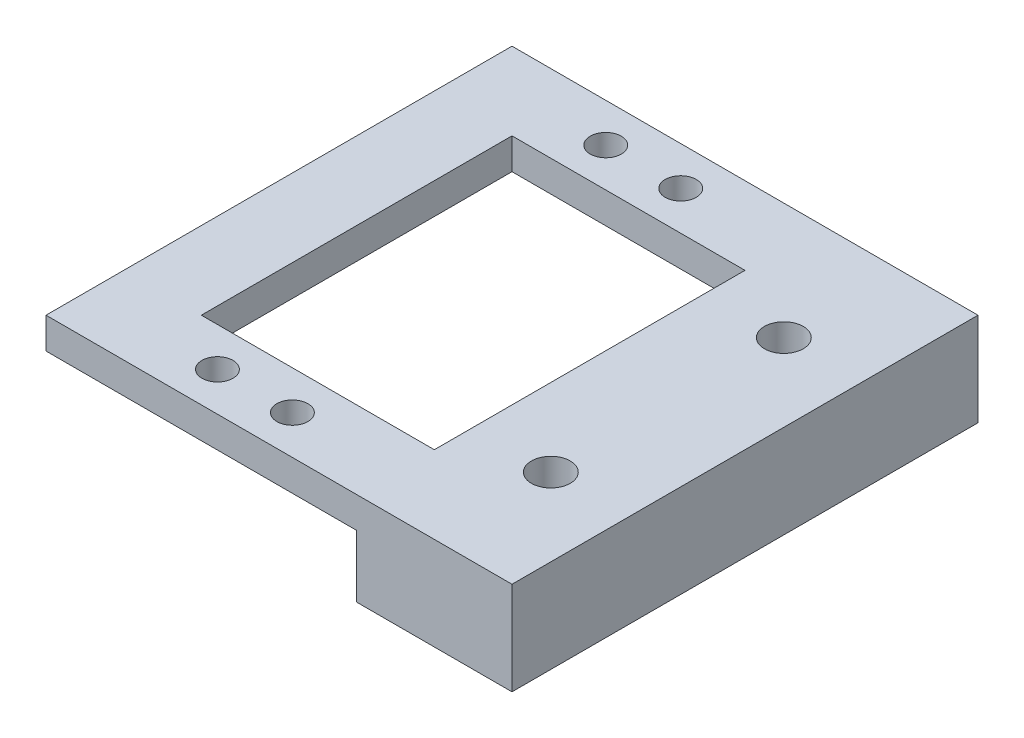
ISO-10303-21;
HEADER;
FILE_DESCRIPTION(('STEP AP214'),'2;1');
FILE_NAME('part.step','',(''),(''),'','','');
FILE_SCHEMA(('AUTOMOTIVE_DESIGN { 1 0 10303 214 1 1 1 1 }'));
ENDSEC;
DATA;
#1=APPLICATION_CONTEXT('core data for automotive mechanical design processes');
#2=APPLICATION_PROTOCOL_DEFINITION('international standard','automotive_design',2000,#1);
#3=PRODUCT_CONTEXT('',#1,'mechanical');
#4=PRODUCT('Part','Part','',(#3));
#5=PRODUCT_RELATED_PRODUCT_CATEGORY('part','',(#4));
#6=PRODUCT_DEFINITION_FORMATION('','',#4);
#7=PRODUCT_DEFINITION_CONTEXT('part definition',#1,'design');
#8=PRODUCT_DEFINITION('design','',#6,#7);
#9=PRODUCT_DEFINITION_SHAPE('','',#8);
#10=(LENGTH_UNIT() NAMED_UNIT(*) SI_UNIT(.MILLI.,.METRE.));
#11=(NAMED_UNIT(*) PLANE_ANGLE_UNIT() SI_UNIT($,.RADIAN.));
#12=(NAMED_UNIT(*) SI_UNIT($,.STERADIAN.) SOLID_ANGLE_UNIT());
#13=UNCERTAINTY_MEASURE_WITH_UNIT(LENGTH_MEASURE(1.E-05),#10,'distance_accuracy_value','');
#14=(GEOMETRIC_REPRESENTATION_CONTEXT(3) GLOBAL_UNCERTAINTY_ASSIGNED_CONTEXT((#13)) GLOBAL_UNIT_ASSIGNED_CONTEXT((#10,
#11,#12)) REPRESENTATION_CONTEXT('',''));
#15=CARTESIAN_POINT('',(0.,0.,0.));
#16=DIRECTION('',(0.,0.,1.));
#17=DIRECTION('',(1.,0.,0.));
#18=AXIS2_PLACEMENT_3D('',#15,#16,#17);
#19=CARTESIAN_POINT('',(10.,8.,-30.));
#20=DIRECTION('',(-1.,0.,0.));
#21=DIRECTION('',(0.,0.,1.));
#22=AXIS2_PLACEMENT_3D('',#19,#20,#21);
#23=PLANE('',#22);
#24=DIRECTION('',(0.,0.,-1.));
#25=VECTOR('',#24,1.);
#26=CARTESIAN_POINT('',(10.,0.,-30.));
#27=LINE('',#26,#25);
#28=CARTESIAN_POINT('',(10.,0.,30.));
#29=VERTEX_POINT('',#28);
#30=CARTESIAN_POINT('',(10.,0.,-30.));
#31=VERTEX_POINT('',#30);
#32=EDGE_CURVE('E202',#29,#31,#27,.T.);
#33=ORIENTED_EDGE('',*,*,#32,.T.);
#34=DIRECTION('',(0.,-1.,0.));
#35=VECTOR('',#34,1.);
#36=CARTESIAN_POINT('',(10.,8.,-30.));
#37=LINE('',#36,#35);
#38=CARTESIAN_POINT('',(10.,12.,-30.));
#39=VERTEX_POINT('',#38);
#40=EDGE_CURVE('E11',#39,#31,#37,.T.);
#41=ORIENTED_EDGE('',*,*,#40,.F.);
#42=DIRECTION('',(0.,0.,-1.));
#43=VECTOR('',#42,1.);
#44=CARTESIAN_POINT('',(10.,12.,0.));
#45=LINE('',#44,#43);
#46=CARTESIAN_POINT('',(10.,12.,30.));
#47=VERTEX_POINT('',#46);
#48=EDGE_CURVE('E164',#47,#39,#45,.T.);
#49=ORIENTED_EDGE('',*,*,#48,.F.);
#50=DIRECTION('',(0.,-1.,0.));
#51=VECTOR('',#50,1.);
#52=CARTESIAN_POINT('',(10.,8.,30.));
#53=LINE('',#52,#51);
#54=EDGE_CURVE('E206',#47,#29,#53,.T.);
#55=ORIENTED_EDGE('',*,*,#54,.T.);
#56=EDGE_LOOP('',(#33,#41,#49,#55));
#57=FACE_BOUND('',#56,.T.);
#58=ADVANCED_FACE('F49',(#57),#23,.F.);
#59=CARTESIAN_POINT('',(-10.,8.,-30.));
#60=DIRECTION('',(0.,0.,1.));
#61=DIRECTION('',(1.,0.,0.));
#62=AXIS2_PLACEMENT_3D('',#59,#60,#61);
#63=PLANE('',#62);
#64=DIRECTION('',(-1.,0.,0.));
#65=VECTOR('',#64,1.);
#66=CARTESIAN_POINT('',(0.,8.,-30.));
#67=LINE('',#66,#65);
#68=CARTESIAN_POINT('',(-10.,8.,-30.));
#69=VERTEX_POINT('',#68);
#70=CARTESIAN_POINT('',(-50.,8.,-30.));
#71=VERTEX_POINT('',#70);
#72=EDGE_CURVE('E184',#69,#71,#67,.T.);
#73=ORIENTED_EDGE('',*,*,#72,.T.);
#74=DIRECTION('',(0.,-1.,0.));
#75=VECTOR('',#74,1.);
#76=CARTESIAN_POINT('',(-50.,12.,-30.));
#77=LINE('',#76,#75);
#78=CARTESIAN_POINT('',(-50.,12.,-30.));
#79=VERTEX_POINT('',#78);
#80=EDGE_CURVE('E192',#79,#71,#77,.T.);
#81=ORIENTED_EDGE('',*,*,#80,.F.);
#82=DIRECTION('',(-1.,0.,0.));
#83=VECTOR('',#82,1.);
#84=CARTESIAN_POINT('',(0.,12.,-30.));
#85=LINE('',#84,#83);
#86=EDGE_CURVE('E168',#39,#79,#85,.T.);
#87=ORIENTED_EDGE('',*,*,#86,.F.);
#88=ORIENTED_EDGE('',*,*,#40,.T.);
#89=DIRECTION('',(-1.,0.,0.));
#90=VECTOR('',#89,1.);
#91=CARTESIAN_POINT('',(-10.,0.,-30.));
#92=LINE('',#91,#90);
#93=CARTESIAN_POINT('',(-10.,0.,-30.));
#94=VERTEX_POINT('',#93);
#95=EDGE_CURVE('E211',#31,#94,#92,.T.);
#96=ORIENTED_EDGE('',*,*,#95,.T.);
#97=DIRECTION('',(0.,-1.,0.));
#98=VECTOR('',#97,1.);
#99=CARTESIAN_POINT('',(-10.,8.,-30.));
#100=LINE('',#99,#98);
#101=EDGE_CURVE('E58',#69,#94,#100,.T.);
#102=ORIENTED_EDGE('',*,*,#101,.F.);
#103=EDGE_LOOP('',(#73,#81,#87,#88,#96,#102));
#104=FACE_BOUND('',#103,.T.);
#105=ADVANCED_FACE('F289',(#104),#63,.F.);
#106=CARTESIAN_POINT('',(-10.,8.,-30.));
#107=DIRECTION('',(1.,0.,0.));
#108=DIRECTION('',(0.,0.,-1.));
#109=AXIS2_PLACEMENT_3D('',#106,#107,#108);
#110=PLANE('',#109);
#111=DIRECTION('',(0.,0.,1.));
#112=VECTOR('',#111,1.);
#113=CARTESIAN_POINT('',(-10.,0.,-30.));
#114=LINE('',#113,#112);
#115=CARTESIAN_POINT('',(-9.99999999999999,0.,30.));
#116=VERTEX_POINT('',#115);
#117=EDGE_CURVE('E214',#94,#116,#114,.T.);
#118=ORIENTED_EDGE('',*,*,#117,.T.);
#119=DIRECTION('',(0.,-1.,0.));
#120=VECTOR('',#119,1.);
#121=CARTESIAN_POINT('',(-9.99999999999999,8.,30.));
#122=LINE('',#121,#120);
#123=CARTESIAN_POINT('',(-10.,8.,30.));
#124=VERTEX_POINT('',#123);
#125=EDGE_CURVE('E223',#124,#116,#122,.T.);
#126=ORIENTED_EDGE('',*,*,#125,.F.);
#127=DIRECTION('',(0.,0.,1.));
#128=VECTOR('',#127,1.);
#129=CARTESIAN_POINT('',(-10.,8.,-30.));
#130=LINE('',#129,#128);
#131=CARTESIAN_POINT('',(-9.99999999999999,8.,20.));
#132=VERTEX_POINT('',#131);
#133=EDGE_CURVE('E207',#132,#124,#130,.T.);
#134=ORIENTED_EDGE('',*,*,#133,.F.);
#135=DIRECTION('',(0.,-1.,0.));
#136=VECTOR('',#135,1.);
#137=CARTESIAN_POINT('',(-10.,12.,20.));
#138=LINE('',#137,#136);
#139=CARTESIAN_POINT('',(-10.,12.,20.));
#140=VERTEX_POINT('',#139);
#141=EDGE_CURVE('E199',#140,#132,#138,.T.);
#142=ORIENTED_EDGE('',*,*,#141,.F.);
#143=DIRECTION('',(0.,0.,1.));
#144=VECTOR('',#143,1.);
#145=CARTESIAN_POINT('',(-10.,12.,0.));
#146=LINE('',#145,#144);
#147=CARTESIAN_POINT('',(-10.,12.,-20.));
#148=VERTEX_POINT('',#147);
#149=EDGE_CURVE('E150',#148,#140,#146,.T.);
#150=ORIENTED_EDGE('',*,*,#149,.F.);
#151=DIRECTION('',(0.,-1.,0.));
#152=VECTOR('',#151,1.);
#153=CARTESIAN_POINT('',(-10.,12.,-20.));
#154=LINE('',#153,#152);
#155=CARTESIAN_POINT('',(-10.,8.,-20.));
#156=VERTEX_POINT('',#155);
#157=EDGE_CURVE('E174',#148,#156,#154,.T.);
#158=ORIENTED_EDGE('',*,*,#157,.T.);
#159=EDGE_CURVE('E203',#69,#156,#130,.T.);
#160=ORIENTED_EDGE('',*,*,#159,.F.);
#161=ORIENTED_EDGE('',*,*,#101,.T.);
#162=EDGE_LOOP('',(#118,#126,#134,#142,#150,#158,#160,#161));
#163=FACE_BOUND('',#162,.T.);
#164=ADVANCED_FACE('F276',(#163),#110,.F.);
#165=CARTESIAN_POINT('',(-9.99999999999999,8.,30.));
#166=DIRECTION('',(0.,0.,-1.));
#167=DIRECTION('',(-1.,0.,0.));
#168=AXIS2_PLACEMENT_3D('',#165,#166,#167);
#169=PLANE('',#168);
#170=ORIENTED_EDGE('',*,*,#54,.F.);
#171=DIRECTION('',(1.,0.,0.));
#172=VECTOR('',#171,1.);
#173=CARTESIAN_POINT('',(0.,12.,30.));
#174=LINE('',#173,#172);
#175=CARTESIAN_POINT('',(-50.,12.,30.));
#176=VERTEX_POINT('',#175);
#177=EDGE_CURVE('E157',#176,#47,#174,.T.);
#178=ORIENTED_EDGE('',*,*,#177,.F.);
#179=DIRECTION('',(0.,-1.,0.));
#180=VECTOR('',#179,1.);
#181=CARTESIAN_POINT('',(-50.,12.,30.));
#182=LINE('',#181,#180);
#183=CARTESIAN_POINT('',(-50.,8.,30.));
#184=VERTEX_POINT('',#183);
#185=EDGE_CURVE('E196',#176,#184,#182,.T.);
#186=ORIENTED_EDGE('',*,*,#185,.T.);
#187=DIRECTION('',(1.,0.,0.));
#188=VECTOR('',#187,1.);
#189=CARTESIAN_POINT('',(0.,8.,30.));
#190=LINE('',#189,#188);
#191=EDGE_CURVE('E181',#184,#124,#190,.T.);
#192=ORIENTED_EDGE('',*,*,#191,.T.);
#193=ORIENTED_EDGE('',*,*,#125,.T.);
#194=DIRECTION('',(1.,0.,0.));
#195=VECTOR('',#194,1.);
#196=CARTESIAN_POINT('',(-9.99999999999999,0.,30.));
#197=LINE('',#196,#195);
#198=EDGE_CURVE('E217',#116,#29,#197,.T.);
#199=ORIENTED_EDGE('',*,*,#198,.T.);
#200=EDGE_LOOP('',(#170,#178,#186,#192,#193,#199));
#201=FACE_BOUND('',#200,.T.);
#202=ADVANCED_FACE('F296',(#201),#169,.F.);
#203=CARTESIAN_POINT('',(0.,0.,0.));
#204=DIRECTION('',(0.,1.,0.));
#205=DIRECTION('',(0.,0.,1.));
#206=AXIS2_PLACEMENT_3D('',#203,#204,#205);
#207=PLANE('',#206);
#208=CARTESIAN_POINT('',(0.,0.,-15.));
#209=DIRECTION('',(0.,1.,0.));
#210=DIRECTION('',(0.,0.,1.));
#211=AXIS2_PLACEMENT_3D('',#208,#209,#210);
#212=CIRCLE('',#211,2.5);
#213=CARTESIAN_POINT('',(0.,0.,-12.5));
#214=VERTEX_POINT('',#213);
#215=EDGE_CURVE('E136',#214,#214,#212,.T.);
#216=ORIENTED_EDGE('',*,*,#215,.T.);
#217=EDGE_LOOP('',(#216));
#218=FACE_BOUND('',#217,.T.);
#219=CARTESIAN_POINT('',(0.,0.,15.));
#220=DIRECTION('',(0.,1.,0.));
#221=DIRECTION('',(0.,0.,1.));
#222=AXIS2_PLACEMENT_3D('',#219,#220,#221);
#223=CIRCLE('',#222,2.5);
#224=CARTESIAN_POINT('',(0.,0.,17.5));
#225=VERTEX_POINT('',#224);
#226=EDGE_CURVE('E256',#225,#225,#223,.T.);
#227=ORIENTED_EDGE('',*,*,#226,.T.);
#228=EDGE_LOOP('',(#227));
#229=FACE_BOUND('',#228,.T.);
#230=ORIENTED_EDGE('',*,*,#32,.F.);
#231=ORIENTED_EDGE('',*,*,#198,.F.);
#232=ORIENTED_EDGE('',*,*,#117,.F.);
#233=ORIENTED_EDGE('',*,*,#95,.F.);
#234=EDGE_LOOP('',(#230,#231,#232,#233));
#235=FACE_BOUND('',#234,.T.);
#236=ADVANCED_FACE('F294',(#218,#229,#235),#207,.F.);
#237=CARTESIAN_POINT('',(0.,8.,0.));
#238=DIRECTION('',(0.,1.,0.));
#239=DIRECTION('',(0.,0.,1.));
#240=AXIS2_PLACEMENT_3D('',#237,#238,#239);
#241=PLANE('',#240);
#242=CARTESIAN_POINT('',(-32.925,8.,25.));
#243=DIRECTION('',(0.,-1.,0.));
#244=DIRECTION('',(0.,0.,-1.));
#245=AXIS2_PLACEMENT_3D('',#242,#243,#244);
#246=CIRCLE('',#245,2.);
#247=CARTESIAN_POINT('',(-32.925,8.,23.));
#248=VERTEX_POINT('',#247);
#249=EDGE_CURVE('E336',#248,#248,#246,.T.);
#250=ORIENTED_EDGE('',*,*,#249,.F.);
#251=EDGE_LOOP('',(#250));
#252=FACE_BOUND('',#251,.T.);
#253=CARTESIAN_POINT('',(-23.275,8.,-25.));
#254=DIRECTION('',(0.,-1.,0.));
#255=DIRECTION('',(0.,0.,-1.));
#256=AXIS2_PLACEMENT_3D('',#253,#254,#255);
#257=CIRCLE('',#256,2.);
#258=CARTESIAN_POINT('',(-23.275,8.,-27.));
#259=VERTEX_POINT('',#258);
#260=EDGE_CURVE('E340',#259,#259,#257,.T.);
#261=ORIENTED_EDGE('',*,*,#260,.F.);
#262=EDGE_LOOP('',(#261));
#263=FACE_BOUND('',#262,.T.);
#264=CARTESIAN_POINT('',(-32.925,8.,-25.));
#265=DIRECTION('',(0.,-1.,0.));
#266=DIRECTION('',(0.,0.,-1.));
#267=AXIS2_PLACEMENT_3D('',#264,#265,#266);
#268=CIRCLE('',#267,2.);
#269=CARTESIAN_POINT('',(-32.925,8.,-27.));
#270=VERTEX_POINT('',#269);
#271=EDGE_CURVE('E344',#270,#270,#268,.T.);
#272=ORIENTED_EDGE('',*,*,#271,.F.);
#273=EDGE_LOOP('',(#272));
#274=FACE_BOUND('',#273,.T.);
#275=CARTESIAN_POINT('',(-23.275,8.,25.));
#276=DIRECTION('',(0.,-1.,0.));
#277=DIRECTION('',(0.,0.,-1.));
#278=AXIS2_PLACEMENT_3D('',#275,#276,#277);
#279=CIRCLE('',#278,2.);
#280=CARTESIAN_POINT('',(-23.275,8.,23.));
#281=VERTEX_POINT('',#280);
#282=EDGE_CURVE('E235',#281,#281,#279,.T.);
#283=ORIENTED_EDGE('',*,*,#282,.F.);
#284=EDGE_LOOP('',(#283));
#285=FACE_BOUND('',#284,.T.);
#286=DIRECTION('',(-1.,0.,0.));
#287=VECTOR('',#286,1.);
#288=CARTESIAN_POINT('',(0.,8.,-20.));
#289=LINE('',#288,#287);
#290=CARTESIAN_POINT('',(-40.,8.,-20.));
#291=VERTEX_POINT('',#290);
#292=EDGE_CURVE('E159',#156,#291,#289,.T.);
#293=ORIENTED_EDGE('',*,*,#292,.T.);
#294=DIRECTION('',(0.,0.,-1.));
#295=VECTOR('',#294,1.);
#296=CARTESIAN_POINT('',(-40.,8.,-30.));
#297=LINE('',#296,#295);
#298=CARTESIAN_POINT('',(-40.,8.,20.));
#299=VERTEX_POINT('',#298);
#300=EDGE_CURVE('E135',#299,#291,#297,.T.);
#301=ORIENTED_EDGE('',*,*,#300,.F.);
#302=DIRECTION('',(-1.,0.,0.));
#303=VECTOR('',#302,1.);
#304=CARTESIAN_POINT('',(0.,8.,20.));
#305=LINE('',#304,#303);
#306=EDGE_CURVE('E145',#132,#299,#305,.T.);
#307=ORIENTED_EDGE('',*,*,#306,.F.);
#308=ORIENTED_EDGE('',*,*,#133,.T.);
#309=ORIENTED_EDGE('',*,*,#191,.F.);
#310=DIRECTION('',(0.,0.,-1.));
#311=VECTOR('',#310,1.);
#312=CARTESIAN_POINT('',(-50.,8.,0.));
#313=LINE('',#312,#311);
#314=EDGE_CURVE('E177',#184,#71,#313,.T.);
#315=ORIENTED_EDGE('',*,*,#314,.T.);
#316=ORIENTED_EDGE('',*,*,#72,.F.);
#317=ORIENTED_EDGE('',*,*,#159,.T.);
#318=EDGE_LOOP('',(#293,#301,#307,#308,#309,#315,#316,#317));
#319=FACE_BOUND('',#318,.T.);
#320=ADVANCED_FACE('F270',(#252,#263,#274,#285,#319),#241,.F.);
#321=CARTESIAN_POINT('',(0.,12.,20.));
#322=DIRECTION('',(0.,0.,1.));
#323=DIRECTION('',(1.,0.,0.));
#324=AXIS2_PLACEMENT_3D('',#321,#322,#323);
#325=PLANE('',#324);
#326=ORIENTED_EDGE('',*,*,#306,.T.);
#327=DIRECTION('',(0.,1.,0.));
#328=VECTOR('',#327,1.);
#329=CARTESIAN_POINT('',(-40.,12.,20.));
#330=LINE('',#329,#328);
#331=CARTESIAN_POINT('',(-40.,12.,20.));
#332=VERTEX_POINT('',#331);
#333=EDGE_CURVE('E130',#299,#332,#330,.T.);
#334=ORIENTED_EDGE('',*,*,#333,.T.);
#335=DIRECTION('',(-1.,0.,0.));
#336=VECTOR('',#335,1.);
#337=CARTESIAN_POINT('',(0.,12.,20.));
#338=LINE('',#337,#336);
#339=EDGE_CURVE('E142',#140,#332,#338,.T.);
#340=ORIENTED_EDGE('',*,*,#339,.F.);
#341=ORIENTED_EDGE('',*,*,#141,.T.);
#342=EDGE_LOOP('',(#326,#334,#340,#341));
#343=FACE_BOUND('',#342,.T.);
#344=ADVANCED_FACE('F140',(#343),#325,.F.);
#345=CARTESIAN_POINT('',(-50.,12.,0.));
#346=DIRECTION('',(-1.,0.,0.));
#347=DIRECTION('',(0.,0.,1.));
#348=AXIS2_PLACEMENT_3D('',#345,#346,#347);
#349=PLANE('',#348);
#350=ORIENTED_EDGE('',*,*,#314,.F.);
#351=ORIENTED_EDGE('',*,*,#185,.F.);
#352=DIRECTION('',(0.,0.,-1.));
#353=VECTOR('',#352,1.);
#354=CARTESIAN_POINT('',(-50.,12.,0.));
#355=LINE('',#354,#353);
#356=EDGE_CURVE('E153',#176,#79,#355,.T.);
#357=ORIENTED_EDGE('',*,*,#356,.T.);
#358=ORIENTED_EDGE('',*,*,#80,.T.);
#359=EDGE_LOOP('',(#350,#351,#357,#358));
#360=FACE_BOUND('',#359,.T.);
#361=ADVANCED_FACE('F283',(#360),#349,.T.);
#362=CARTESIAN_POINT('',(0.,12.,-20.));
#363=DIRECTION('',(0.,0.,1.));
#364=DIRECTION('',(1.,0.,0.));
#365=AXIS2_PLACEMENT_3D('',#362,#363,#364);
#366=PLANE('',#365);
#367=DIRECTION('',(0.,1.,0.));
#368=VECTOR('',#367,1.);
#369=CARTESIAN_POINT('',(-40.,12.,-20.));
#370=LINE('',#369,#368);
#371=CARTESIAN_POINT('',(-40.,12.,-20.));
#372=VERTEX_POINT('',#371);
#373=EDGE_CURVE('E66',#291,#372,#370,.T.);
#374=ORIENTED_EDGE('',*,*,#373,.F.);
#375=ORIENTED_EDGE('',*,*,#292,.F.);
#376=ORIENTED_EDGE('',*,*,#157,.F.);
#377=DIRECTION('',(-1.,0.,0.));
#378=VECTOR('',#377,1.);
#379=CARTESIAN_POINT('',(0.,12.,-20.));
#380=LINE('',#379,#378);
#381=EDGE_CURVE('E71',#148,#372,#380,.T.);
#382=ORIENTED_EDGE('',*,*,#381,.T.);
#383=EDGE_LOOP('',(#374,#375,#376,#382));
#384=FACE_BOUND('',#383,.T.);
#385=ADVANCED_FACE('F274',(#384),#366,.T.);
#386=CARTESIAN_POINT('',(0.,12.,0.));
#387=DIRECTION('',(0.,1.,0.));
#388=DIRECTION('',(0.,0.,1.));
#389=AXIS2_PLACEMENT_3D('',#386,#387,#388);
#390=PLANE('',#389);
#391=CARTESIAN_POINT('',(-32.925,12.,25.));
#392=DIRECTION('',(0.,1.,0.));
#393=DIRECTION('',(0.,0.,1.));
#394=AXIS2_PLACEMENT_3D('',#391,#392,#393);
#395=CIRCLE('',#394,2.);
#396=CARTESIAN_POINT('',(-32.925,12.,27.));
#397=VERTEX_POINT('',#396);
#398=EDGE_CURVE('E52',#397,#397,#395,.T.);
#399=ORIENTED_EDGE('',*,*,#398,.F.);
#400=EDGE_LOOP('',(#399));
#401=FACE_BOUND('',#400,.T.);
#402=CARTESIAN_POINT('',(-23.275,12.,-25.));
#403=DIRECTION('',(0.,1.,0.));
#404=DIRECTION('',(0.,0.,1.));
#405=AXIS2_PLACEMENT_3D('',#402,#403,#404);
#406=CIRCLE('',#405,2.);
#407=CARTESIAN_POINT('',(-23.275,12.,-23.));
#408=VERTEX_POINT('',#407);
#409=EDGE_CURVE('E238',#408,#408,#406,.T.);
#410=ORIENTED_EDGE('',*,*,#409,.F.);
#411=EDGE_LOOP('',(#410));
#412=FACE_BOUND('',#411,.T.);
#413=CARTESIAN_POINT('',(-32.925,12.,-25.));
#414=DIRECTION('',(0.,1.,0.));
#415=DIRECTION('',(0.,0.,1.));
#416=AXIS2_PLACEMENT_3D('',#413,#414,#415);
#417=CIRCLE('',#416,2.);
#418=CARTESIAN_POINT('',(-32.925,12.,-23.));
#419=VERTEX_POINT('',#418);
#420=EDGE_CURVE('E234',#419,#419,#417,.T.);
#421=ORIENTED_EDGE('',*,*,#420,.F.);
#422=EDGE_LOOP('',(#421));
#423=FACE_BOUND('',#422,.T.);
#424=CARTESIAN_POINT('',(-23.275,12.,25.));
#425=DIRECTION('',(0.,1.,0.));
#426=DIRECTION('',(0.,0.,1.));
#427=AXIS2_PLACEMENT_3D('',#424,#425,#426);
#428=CIRCLE('',#427,2.);
#429=CARTESIAN_POINT('',(-23.275,12.,27.));
#430=VERTEX_POINT('',#429);
#431=EDGE_CURVE('E230',#430,#430,#428,.T.);
#432=ORIENTED_EDGE('',*,*,#431,.F.);
#433=EDGE_LOOP('',(#432));
#434=FACE_BOUND('',#433,.T.);
#435=CARTESIAN_POINT('',(0.,12.,-15.));
#436=DIRECTION('',(0.,1.,0.));
#437=DIRECTION('',(0.,0.,1.));
#438=AXIS2_PLACEMENT_3D('',#435,#436,#437);
#439=CIRCLE('',#438,2.5);
#440=CARTESIAN_POINT('',(0.,12.,-12.5));
#441=VERTEX_POINT('',#440);
#442=EDGE_CURVE('E250',#441,#441,#439,.T.);
#443=ORIENTED_EDGE('',*,*,#442,.F.);
#444=EDGE_LOOP('',(#443));
#445=FACE_BOUND('',#444,.T.);
#446=CARTESIAN_POINT('',(0.,12.,15.));
#447=DIRECTION('',(0.,1.,0.));
#448=DIRECTION('',(0.,0.,1.));
#449=AXIS2_PLACEMENT_3D('',#446,#447,#448);
#450=CIRCLE('',#449,2.5);
#451=CARTESIAN_POINT('',(0.,12.,17.5));
#452=VERTEX_POINT('',#451);
#453=EDGE_CURVE('E245',#452,#452,#450,.T.);
#454=ORIENTED_EDGE('',*,*,#453,.F.);
#455=EDGE_LOOP('',(#454));
#456=FACE_BOUND('',#455,.T.);
#457=ORIENTED_EDGE('',*,*,#86,.T.);
#458=ORIENTED_EDGE('',*,*,#356,.F.);
#459=ORIENTED_EDGE('',*,*,#177,.T.);
#460=ORIENTED_EDGE('',*,*,#48,.T.);
#461=EDGE_LOOP('',(#457,#458,#459,#460));
#462=FACE_BOUND('',#461,.T.);
#463=ORIENTED_EDGE('',*,*,#339,.T.);
#464=DIRECTION('',(0.,0.,-1.));
#465=VECTOR('',#464,1.);
#466=CARTESIAN_POINT('',(-40.,12.,-30.));
#467=LINE('',#466,#465);
#468=EDGE_CURVE('E126',#332,#372,#467,.T.);
#469=ORIENTED_EDGE('',*,*,#468,.T.);
#470=ORIENTED_EDGE('',*,*,#381,.F.);
#471=ORIENTED_EDGE('',*,*,#149,.T.);
#472=EDGE_LOOP('',(#463,#469,#470,#471));
#473=FACE_BOUND('',#472,.T.);
#474=ADVANCED_FACE('F148',(#401,#412,#423,#434,#445,#456,#462,#473),#390,.T.);
#475=CARTESIAN_POINT('',(-40.,8.,-30.));
#476=DIRECTION('',(1.,0.,0.));
#477=DIRECTION('',(0.,0.,-1.));
#478=AXIS2_PLACEMENT_3D('',#475,#476,#477);
#479=PLANE('',#478);
#480=ORIENTED_EDGE('',*,*,#333,.F.);
#481=ORIENTED_EDGE('',*,*,#300,.T.);
#482=ORIENTED_EDGE('',*,*,#373,.T.);
#483=ORIENTED_EDGE('',*,*,#468,.F.);
#484=EDGE_LOOP('',(#480,#481,#482,#483));
#485=FACE_BOUND('',#484,.T.);
#486=ADVANCED_FACE('F128',(#485),#479,.T.);
#487=CARTESIAN_POINT('',(0.,-55.,15.));
#488=DIRECTION('',(0.,1.,0.));
#489=DIRECTION('',(0.,0.,1.));
#490=AXIS2_PLACEMENT_3D('',#487,#488,#489);
#491=CYLINDRICAL_SURFACE('',#490,2.5);
#492=ORIENTED_EDGE('',*,*,#453,.T.);
#493=EDGE_LOOP('',(#492));
#494=FACE_BOUND('',#493,.T.);
#495=ORIENTED_EDGE('',*,*,#226,.F.);
#496=EDGE_LOOP('',(#495));
#497=FACE_BOUND('',#496,.T.);
#498=ADVANCED_FACE('F307',(#494,#497),#491,.F.);
#499=CARTESIAN_POINT('',(0.,-55.,-15.));
#500=DIRECTION('',(0.,1.,0.));
#501=DIRECTION('',(0.,0.,1.));
#502=AXIS2_PLACEMENT_3D('',#499,#500,#501);
#503=CYLINDRICAL_SURFACE('',#502,2.5);
#504=ORIENTED_EDGE('',*,*,#442,.T.);
#505=EDGE_LOOP('',(#504));
#506=FACE_BOUND('',#505,.T.);
#507=ORIENTED_EDGE('',*,*,#215,.F.);
#508=EDGE_LOOP('',(#507));
#509=FACE_BOUND('',#508,.T.);
#510=ADVANCED_FACE('F368',(#506,#509),#503,.F.);
#511=CARTESIAN_POINT('',(-23.275,18.,25.));
#512=DIRECTION('',(0.,-1.,0.));
#513=DIRECTION('',(0.,0.,-1.));
#514=AXIS2_PLACEMENT_3D('',#511,#512,#513);
#515=CYLINDRICAL_SURFACE('',#514,2.);
#516=ORIENTED_EDGE('',*,*,#431,.T.);
#517=EDGE_LOOP('',(#516));
#518=FACE_BOUND('',#517,.T.);
#519=ORIENTED_EDGE('',*,*,#282,.T.);
#520=EDGE_LOOP('',(#519));
#521=FACE_BOUND('',#520,.T.);
#522=ADVANCED_FACE('F359',(#518,#521),#515,.F.);
#523=CARTESIAN_POINT('',(-32.925,18.,-25.));
#524=DIRECTION('',(0.,-1.,0.));
#525=DIRECTION('',(0.,0.,-1.));
#526=AXIS2_PLACEMENT_3D('',#523,#524,#525);
#527=CYLINDRICAL_SURFACE('',#526,2.);
#528=ORIENTED_EDGE('',*,*,#420,.T.);
#529=EDGE_LOOP('',(#528));
#530=FACE_BOUND('',#529,.T.);
#531=ORIENTED_EDGE('',*,*,#271,.T.);
#532=EDGE_LOOP('',(#531));
#533=FACE_BOUND('',#532,.T.);
#534=ADVANCED_FACE('F356',(#530,#533),#527,.F.);
#535=CARTESIAN_POINT('',(-23.275,18.,-25.));
#536=DIRECTION('',(0.,-1.,0.));
#537=DIRECTION('',(0.,0.,-1.));
#538=AXIS2_PLACEMENT_3D('',#535,#536,#537);
#539=CYLINDRICAL_SURFACE('',#538,2.);
#540=ORIENTED_EDGE('',*,*,#409,.T.);
#541=EDGE_LOOP('',(#540));
#542=FACE_BOUND('',#541,.T.);
#543=ORIENTED_EDGE('',*,*,#260,.T.);
#544=EDGE_LOOP('',(#543));
#545=FACE_BOUND('',#544,.T.);
#546=ADVANCED_FACE('F358',(#542,#545),#539,.F.);
#547=CARTESIAN_POINT('',(-32.925,18.,25.));
#548=DIRECTION('',(0.,-1.,0.));
#549=DIRECTION('',(0.,0.,-1.));
#550=AXIS2_PLACEMENT_3D('',#547,#548,#549);
#551=CYLINDRICAL_SURFACE('',#550,2.);
#552=ORIENTED_EDGE('',*,*,#398,.T.);
#553=EDGE_LOOP('',(#552));
#554=FACE_BOUND('',#553,.T.);
#555=ORIENTED_EDGE('',*,*,#249,.T.);
#556=EDGE_LOOP('',(#555));
#557=FACE_BOUND('',#556,.T.);
#558=ADVANCED_FACE('F366',(#554,#557),#551,.F.);
#559=CLOSED_SHELL('',(#58,#105,#164,#202,#236,#320,#344,#361,#385,#474,#486,#498,#510,#522,#534,
#546,#558));
#560=MANIFOLD_SOLID_BREP('B2',#559);
#561=ADVANCED_BREP_SHAPE_REPRESENTATION('',(#18,#560),#14);
#562=SHAPE_DEFINITION_REPRESENTATION(#9,#561);
ENDSEC;
END-ISO-10303-21;
